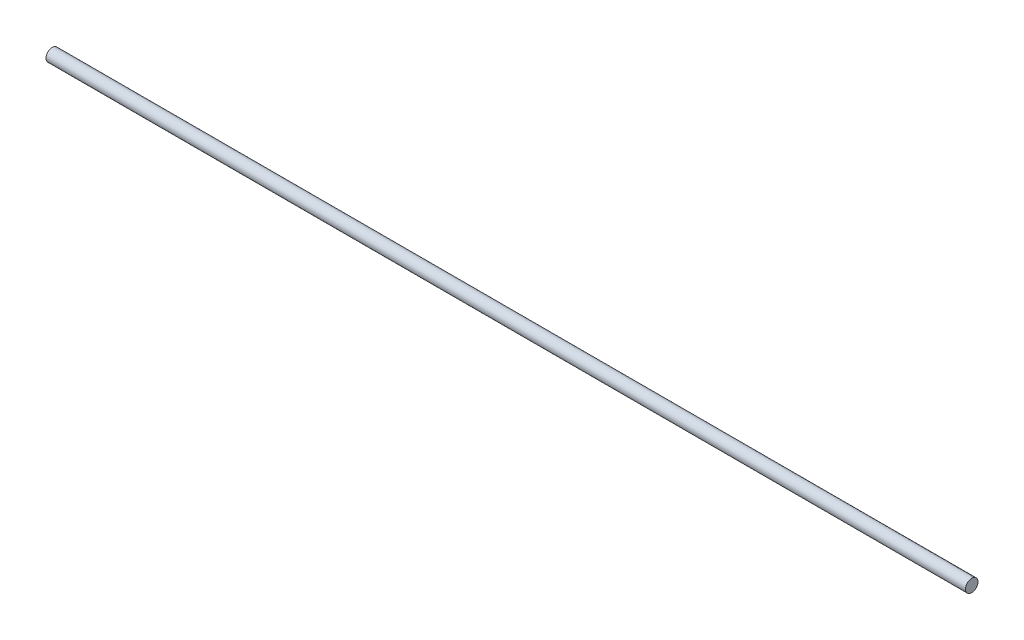
ISO-10303-21;
HEADER;
FILE_DESCRIPTION(('STEP AP214'),'2;1');
FILE_NAME('part.step','',(''),(''),'','','');
FILE_SCHEMA(('AUTOMOTIVE_DESIGN { 1 0 10303 214 1 1 1 1 }'));
ENDSEC;
DATA;
#1=APPLICATION_CONTEXT('core data for automotive mechanical design processes');
#2=APPLICATION_PROTOCOL_DEFINITION('international standard','automotive_design',2000,#1);
#3=PRODUCT_CONTEXT('',#1,'mechanical');
#4=PRODUCT('Part','Part','',(#3));
#5=PRODUCT_RELATED_PRODUCT_CATEGORY('part','',(#4));
#6=PRODUCT_DEFINITION_FORMATION('','',#4);
#7=PRODUCT_DEFINITION_CONTEXT('part definition',#1,'design');
#8=PRODUCT_DEFINITION('design','',#6,#7);
#9=PRODUCT_DEFINITION_SHAPE('','',#8);
#10=(LENGTH_UNIT() NAMED_UNIT(*) SI_UNIT(.MILLI.,.METRE.));
#11=(NAMED_UNIT(*) PLANE_ANGLE_UNIT() SI_UNIT($,.RADIAN.));
#12=(NAMED_UNIT(*) SI_UNIT($,.STERADIAN.) SOLID_ANGLE_UNIT());
#13=UNCERTAINTY_MEASURE_WITH_UNIT(LENGTH_MEASURE(1.E-05),#10,'distance_accuracy_value','');
#14=(GEOMETRIC_REPRESENTATION_CONTEXT(3) GLOBAL_UNCERTAINTY_ASSIGNED_CONTEXT((#13)) GLOBAL_UNIT_ASSIGNED_CONTEXT((#10,
#11,#12)) REPRESENTATION_CONTEXT('',''));
#15=CARTESIAN_POINT('',(0.,0.,0.));
#16=DIRECTION('',(0.,0.,1.));
#17=DIRECTION('',(1.,0.,0.));
#18=AXIS2_PLACEMENT_3D('',#15,#16,#17);
#19=CARTESIAN_POINT('',(-350.,0.,0.));
#20=DIRECTION('',(1.,0.,0.));
#21=DIRECTION('',(0.,0.,-1.));
#22=AXIS2_PLACEMENT_3D('',#19,#20,#21);
#23=PLANE('',#22);
#24=CARTESIAN_POINT('',(-350.,0.,0.));
#25=DIRECTION('',(1.,0.,0.));
#26=DIRECTION('',(0.,0.,-1.));
#27=AXIS2_PLACEMENT_3D('',#24,#25,#26);
#28=CIRCLE('',#27,4.7625);
#29=CARTESIAN_POINT('',(-350.,0.,-4.7625));
#30=VERTEX_POINT('',#29);
#31=EDGE_CURVE('E46',#30,#30,#28,.T.);
#32=ORIENTED_EDGE('',*,*,#31,.F.);
#33=EDGE_LOOP('',(#32));
#34=FACE_BOUND('',#33,.T.);
#35=ADVANCED_FACE('F39',(#34),#23,.F.);
#36=CARTESIAN_POINT('',(350.,0.,0.));
#37=DIRECTION('',(1.,0.,0.));
#38=DIRECTION('',(0.,0.,-1.));
#39=AXIS2_PLACEMENT_3D('',#36,#37,#38);
#40=PLANE('',#39);
#41=CARTESIAN_POINT('',(350.,0.,0.));
#42=DIRECTION('',(1.,0.,0.));
#43=DIRECTION('',(0.,0.,-1.));
#44=AXIS2_PLACEMENT_3D('',#41,#42,#43);
#45=CIRCLE('',#44,4.7625);
#46=CARTESIAN_POINT('',(350.,0.,-4.7625));
#47=VERTEX_POINT('',#46);
#48=EDGE_CURVE('E12',#47,#47,#45,.T.);
#49=ORIENTED_EDGE('',*,*,#48,.T.);
#50=EDGE_LOOP('',(#49));
#51=FACE_BOUND('',#50,.T.);
#52=ADVANCED_FACE('F53',(#51),#40,.T.);
#53=CARTESIAN_POINT('',(-350.,0.,0.));
#54=DIRECTION('',(1.,0.,0.));
#55=DIRECTION('',(0.,0.,-1.));
#56=AXIS2_PLACEMENT_3D('',#53,#54,#55);
#57=CYLINDRICAL_SURFACE('',#56,4.7625);
#58=ORIENTED_EDGE('',*,*,#48,.F.);
#59=EDGE_LOOP('',(#58));
#60=FACE_BOUND('',#59,.T.);
#61=ORIENTED_EDGE('',*,*,#31,.T.);
#62=EDGE_LOOP('',(#61));
#63=FACE_BOUND('',#62,.T.);
#64=ADVANCED_FACE('F55',(#60,#63),#57,.T.);
#65=CLOSED_SHELL('',(#35,#52,#64));
#66=MANIFOLD_SOLID_BREP('B2',#65);
#67=ADVANCED_BREP_SHAPE_REPRESENTATION('',(#18,#66),#14);
#68=SHAPE_DEFINITION_REPRESENTATION(#9,#67);
ENDSEC;
END-ISO-10303-21;
